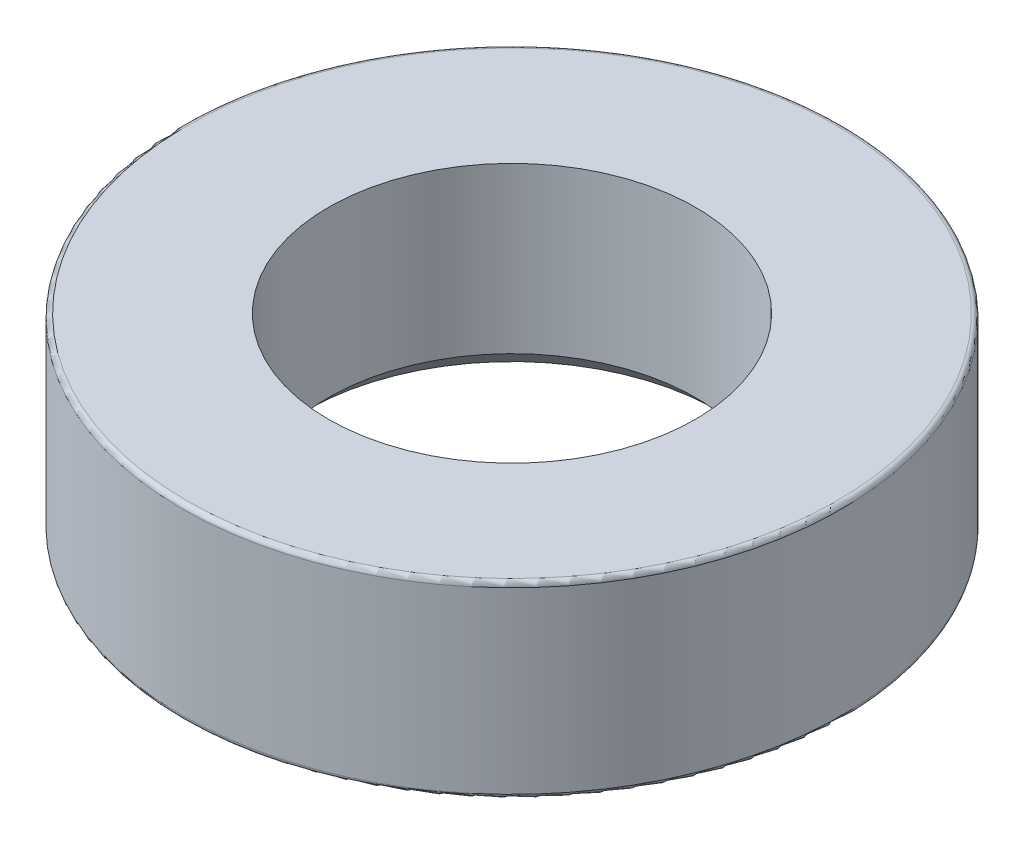
ISO-10303-21;
HEADER;
FILE_DESCRIPTION(('STEP AP214'),'2;1');
FILE_NAME('part.step','',(''),(''),'','','');
FILE_SCHEMA(('AUTOMOTIVE_DESIGN { 1 0 10303 214 1 1 1 1 }'));
ENDSEC;
DATA;
#1=APPLICATION_CONTEXT('core data for automotive mechanical design processes');
#2=APPLICATION_PROTOCOL_DEFINITION('international standard','automotive_design',2000,#1);
#3=PRODUCT_CONTEXT('',#1,'mechanical');
#4=PRODUCT('Part','Part','',(#3));
#5=PRODUCT_RELATED_PRODUCT_CATEGORY('part','',(#4));
#6=PRODUCT_DEFINITION_FORMATION('','',#4);
#7=PRODUCT_DEFINITION_CONTEXT('part definition',#1,'design');
#8=PRODUCT_DEFINITION('design','',#6,#7);
#9=PRODUCT_DEFINITION_SHAPE('','',#8);
#10=(LENGTH_UNIT() NAMED_UNIT(*) SI_UNIT(.MILLI.,.METRE.));
#11=(NAMED_UNIT(*) PLANE_ANGLE_UNIT() SI_UNIT($,.RADIAN.));
#12=(NAMED_UNIT(*) SI_UNIT($,.STERADIAN.) SOLID_ANGLE_UNIT());
#13=UNCERTAINTY_MEASURE_WITH_UNIT(LENGTH_MEASURE(1.E-05),#10,'distance_accuracy_value','');
#14=(GEOMETRIC_REPRESENTATION_CONTEXT(3) GLOBAL_UNCERTAINTY_ASSIGNED_CONTEXT((#13)) GLOBAL_UNIT_ASSIGNED_CONTEXT((#10,
#11,#12)) REPRESENTATION_CONTEXT('',''));
#15=CARTESIAN_POINT('',(0.,0.,0.));
#16=DIRECTION('',(0.,0.,1.));
#17=DIRECTION('',(1.,0.,0.));
#18=AXIS2_PLACEMENT_3D('',#15,#16,#17);
#19=CARTESIAN_POINT('',(0.,2.,0.));
#20=DIRECTION('',(0.,-1.,0.));
#21=DIRECTION('',(0.,0.,-1.));
#22=AXIS2_PLACEMENT_3D('',#19,#20,#21);
#23=CYLINDRICAL_SURFACE('',#22,7.);
#24=CARTESIAN_POINT('',(0.,-1.9,0.));
#25=DIRECTION('',(0.,1.,0.));
#26=DIRECTION('',(0.,0.,1.));
#27=AXIS2_PLACEMENT_3D('',#24,#25,#26);
#28=CIRCLE('',#27,7.);
#29=CARTESIAN_POINT('',(0.,-1.9,7.));
#30=VERTEX_POINT('',#29);
#31=EDGE_CURVE('E46',#30,#30,#28,.T.);
#32=ORIENTED_EDGE('',*,*,#31,.T.);
#33=EDGE_LOOP('',(#32));
#34=FACE_BOUND('',#33,.T.);
#35=CARTESIAN_POINT('',(0.,1.9,0.));
#36=DIRECTION('',(0.,1.,0.));
#37=DIRECTION('',(0.,0.,1.));
#38=AXIS2_PLACEMENT_3D('',#35,#36,#37);
#39=CIRCLE('',#38,7.);
#40=CARTESIAN_POINT('',(0.,1.9,7.));
#41=VERTEX_POINT('',#40);
#42=EDGE_CURVE('E50',#41,#41,#39,.F.);
#43=ORIENTED_EDGE('',*,*,#42,.T.);
#44=EDGE_LOOP('',(#43));
#45=FACE_BOUND('',#44,.T.);
#46=ADVANCED_FACE('F35',(#34,#45),#23,.T.);
#47=CARTESIAN_POINT('',(0.,2.,0.));
#48=DIRECTION('',(0.,1.,0.));
#49=DIRECTION('',(0.,0.,1.));
#50=AXIS2_PLACEMENT_3D('',#47,#48,#49);
#51=PLANE('',#50);
#52=CARTESIAN_POINT('',(0.,2.,0.));
#53=DIRECTION('',(0.,1.,0.));
#54=DIRECTION('',(0.,0.,1.));
#55=AXIS2_PLACEMENT_3D('',#52,#53,#54);
#56=CIRCLE('',#55,6.9);
#57=CARTESIAN_POINT('',(0.,2.,6.9));
#58=VERTEX_POINT('',#57);
#59=EDGE_CURVE('E10',#58,#58,#56,.T.);
#60=ORIENTED_EDGE('',*,*,#59,.T.);
#61=EDGE_LOOP('',(#60));
#62=FACE_BOUND('',#61,.T.);
#63=CARTESIAN_POINT('',(0.,2.,0.));
#64=DIRECTION('',(0.,1.,0.));
#65=DIRECTION('',(0.,0.,1.));
#66=AXIS2_PLACEMENT_3D('',#63,#64,#65);
#67=CIRCLE('',#66,3.9);
#68=CARTESIAN_POINT('',(0.,2.,3.9));
#69=VERTEX_POINT('',#68);
#70=EDGE_CURVE('E61',#69,#69,#67,.T.);
#71=ORIENTED_EDGE('',*,*,#70,.F.);
#72=EDGE_LOOP('',(#71));
#73=FACE_BOUND('',#72,.T.);
#74=ADVANCED_FACE('F67',(#62,#73),#51,.T.);
#75=CARTESIAN_POINT('',(0.,-2.,0.));
#76=DIRECTION('',(0.,1.,0.));
#77=DIRECTION('',(0.,0.,1.));
#78=AXIS2_PLACEMENT_3D('',#75,#76,#77);
#79=PLANE('',#78);
#80=CARTESIAN_POINT('',(0.,-2.,0.));
#81=DIRECTION('',(0.,1.,0.));
#82=DIRECTION('',(0.,0.,1.));
#83=AXIS2_PLACEMENT_3D('',#80,#81,#82);
#84=CIRCLE('',#83,6.9);
#85=CARTESIAN_POINT('',(0.,-2.,6.9));
#86=VERTEX_POINT('',#85);
#87=EDGE_CURVE('E42',#86,#86,#84,.F.);
#88=ORIENTED_EDGE('',*,*,#87,.T.);
#89=EDGE_LOOP('',(#88));
#90=FACE_BOUND('',#89,.T.);
#91=CARTESIAN_POINT('',(0.,-2.,0.));
#92=DIRECTION('',(0.,1.,0.));
#93=DIRECTION('',(0.,0.,1.));
#94=AXIS2_PLACEMENT_3D('',#91,#92,#93);
#95=CIRCLE('',#94,4.4);
#96=CARTESIAN_POINT('',(0.,-2.,4.4));
#97=VERTEX_POINT('',#96);
#98=EDGE_CURVE('E55',#97,#97,#95,.T.);
#99=ORIENTED_EDGE('',*,*,#98,.T.);
#100=EDGE_LOOP('',(#99));
#101=FACE_BOUND('',#100,.T.);
#102=ADVANCED_FACE('F69',(#90,#101),#79,.F.);
#103=CARTESIAN_POINT('',(0.,-2.001,0.));
#104=DIRECTION('',(0.,1.,0.));
#105=DIRECTION('',(0.,0.,1.));
#106=AXIS2_PLACEMENT_3D('',#103,#104,#105);
#107=CYLINDRICAL_SURFACE('',#106,3.9);
#108=CARTESIAN_POINT('',(0.,-1.5,0.));
#109=DIRECTION('',(0.,1.,0.));
#110=DIRECTION('',(0.,0.,1.));
#111=AXIS2_PLACEMENT_3D('',#108,#109,#110);
#112=CIRCLE('',#111,3.9);
#113=CARTESIAN_POINT('',(0.,-1.5,3.9));
#114=VERTEX_POINT('',#113);
#115=EDGE_CURVE('E58',#114,#114,#112,.F.);
#116=ORIENTED_EDGE('',*,*,#115,.T.);
#117=EDGE_LOOP('',(#116));
#118=FACE_BOUND('',#117,.T.);
#119=ORIENTED_EDGE('',*,*,#70,.T.);
#120=EDGE_LOOP('',(#119));
#121=FACE_BOUND('',#120,.T.);
#122=ADVANCED_FACE('F65',(#118,#121),#107,.F.);
#123=CARTESIAN_POINT('',(0.,-1.5,0.));
#124=DIRECTION('',(0.,-1.,0.));
#125=DIRECTION('',(0.,0.,-1.));
#126=AXIS2_PLACEMENT_3D('',#123,#124,#125);
#127=CONICAL_SURFACE('',#126,3.9,0.785398163397449);
#128=ORIENTED_EDGE('',*,*,#98,.F.);
#129=EDGE_LOOP('',(#128));
#130=FACE_BOUND('',#129,.T.);
#131=ORIENTED_EDGE('',*,*,#115,.F.);
#132=EDGE_LOOP('',(#131));
#133=FACE_BOUND('',#132,.T.);
#134=ADVANCED_FACE('F80',(#130,#133),#127,.F.);
#135=CARTESIAN_POINT('',(0.,-1.9,0.));
#136=DIRECTION('',(0.,1.,0.));
#137=DIRECTION('',(0.,0.,1.));
#138=AXIS2_PLACEMENT_3D('',#135,#136,#137);
#139=TOROIDAL_SURFACE('',#138,6.9,0.1);
#140=ORIENTED_EDGE('',*,*,#87,.F.);
#141=EDGE_LOOP('',(#140));
#142=FACE_BOUND('',#141,.T.);
#143=ORIENTED_EDGE('',*,*,#31,.F.);
#144=EDGE_LOOP('',(#143));
#145=FACE_BOUND('',#144,.T.);
#146=ADVANCED_FACE('F82',(#142,#145),#139,.T.);
#147=CARTESIAN_POINT('',(0.,1.9,0.));
#148=DIRECTION('',(0.,1.,0.));
#149=DIRECTION('',(0.,0.,1.));
#150=AXIS2_PLACEMENT_3D('',#147,#148,#149);
#151=TOROIDAL_SURFACE('',#150,6.9,0.1);
#152=ORIENTED_EDGE('',*,*,#42,.F.);
#153=EDGE_LOOP('',(#152));
#154=FACE_BOUND('',#153,.T.);
#155=ORIENTED_EDGE('',*,*,#59,.F.);
#156=EDGE_LOOP('',(#155));
#157=FACE_BOUND('',#156,.T.);
#158=ADVANCED_FACE('F37',(#154,#157),#151,.T.);
#159=CLOSED_SHELL('',(#46,#74,#102,#122,#134,#146,#158));
#160=MANIFOLD_SOLID_BREP('B2',#159);
#161=ADVANCED_BREP_SHAPE_REPRESENTATION('',(#18,#160),#14);
#162=SHAPE_DEFINITION_REPRESENTATION(#9,#161);
ENDSEC;
END-ISO-10303-21;
